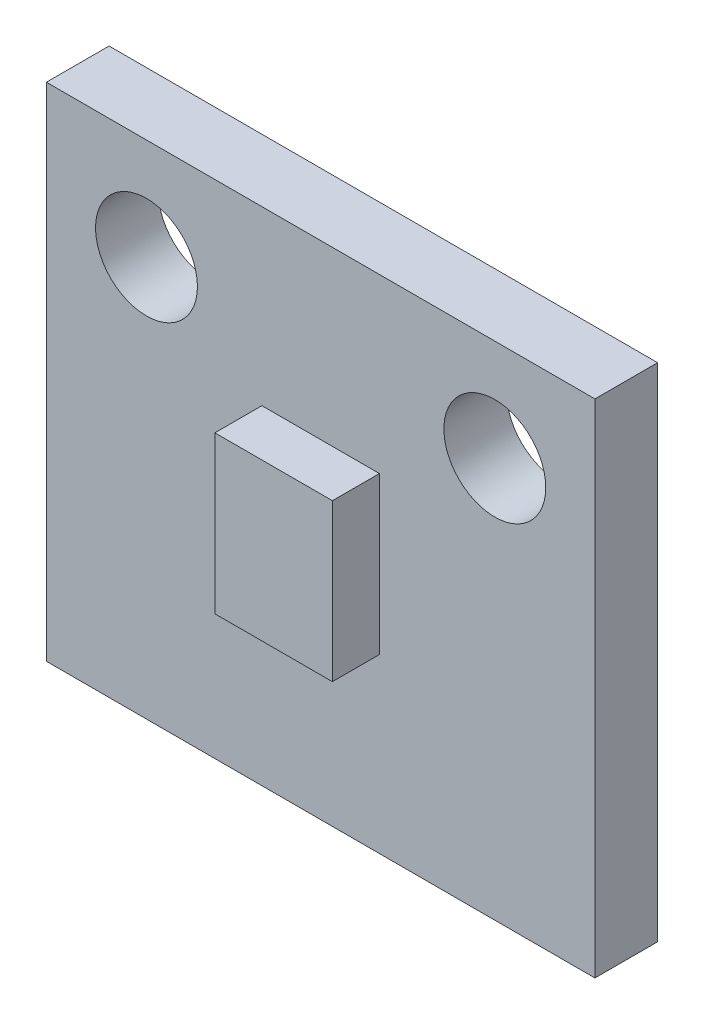
ISO-10303-21;
HEADER;
FILE_DESCRIPTION(('STEP AP214'),'2;1');
FILE_NAME('part.step','',(''),(''),'','','');
FILE_SCHEMA(('AUTOMOTIVE_DESIGN { 1 0 10303 214 1 1 1 1 }'));
ENDSEC;
DATA;
#1=APPLICATION_CONTEXT('core data for automotive mechanical design processes');
#2=APPLICATION_PROTOCOL_DEFINITION('international standard','automotive_design',2000,#1);
#3=PRODUCT_CONTEXT('',#1,'mechanical');
#4=PRODUCT('Part','Part','',(#3));
#5=PRODUCT_RELATED_PRODUCT_CATEGORY('part','',(#4));
#6=PRODUCT_DEFINITION_FORMATION('','',#4);
#7=PRODUCT_DEFINITION_CONTEXT('part definition',#1,'design');
#8=PRODUCT_DEFINITION('design','',#6,#7);
#9=PRODUCT_DEFINITION_SHAPE('','',#8);
#10=(LENGTH_UNIT() NAMED_UNIT(*) SI_UNIT(.MILLI.,.METRE.));
#11=(NAMED_UNIT(*) PLANE_ANGLE_UNIT() SI_UNIT($,.RADIAN.));
#12=(NAMED_UNIT(*) SI_UNIT($,.STERADIAN.) SOLID_ANGLE_UNIT());
#13=UNCERTAINTY_MEASURE_WITH_UNIT(LENGTH_MEASURE(1.E-05),#10,'distance_accuracy_value','');
#14=(GEOMETRIC_REPRESENTATION_CONTEXT(3) GLOBAL_UNCERTAINTY_ASSIGNED_CONTEXT((#13)) GLOBAL_UNIT_ASSIGNED_CONTEXT((#10,
#11,#12)) REPRESENTATION_CONTEXT('',''));
#15=CARTESIAN_POINT('',(0.,0.,0.));
#16=DIRECTION('',(0.,0.,1.));
#17=DIRECTION('',(1.,0.,0.));
#18=AXIS2_PLACEMENT_3D('',#15,#16,#17);
#19=CARTESIAN_POINT('',(0.,0.,-7.4));
#20=DIRECTION('',(0.,0.,-1.));
#21=DIRECTION('',(-1.,0.,0.));
#22=AXIS2_PLACEMENT_3D('',#19,#20,#21);
#23=PLANE('',#22);
#24=CARTESIAN_POINT('',(60.555,36.81,-7.4));
#25=DIRECTION('',(0.,0.,1.));
#26=DIRECTION('',(1.,0.,0.));
#27=AXIS2_PLACEMENT_3D('',#24,#25,#26);
#28=CIRCLE('',#27,1.3);
#29=CARTESIAN_POINT('',(61.855,36.81,-7.4));
#30=VERTEX_POINT('',#29);
#31=EDGE_CURVE('E266',#30,#30,#28,.T.);
#32=ORIENTED_EDGE('',*,*,#31,.F.);
#33=EDGE_LOOP('',(#32));
#34=FACE_BOUND('',#33,.T.);
#35=CARTESIAN_POINT('',(69.445,36.81,-7.4));
#36=DIRECTION('',(0.,0.,1.));
#37=DIRECTION('',(1.,0.,0.));
#38=AXIS2_PLACEMENT_3D('',#35,#36,#37);
#39=CIRCLE('',#38,1.3);
#40=CARTESIAN_POINT('',(70.745,36.81,-7.4));
#41=VERTEX_POINT('',#40);
#42=EDGE_CURVE('E270',#41,#41,#39,.T.);
#43=ORIENTED_EDGE('',*,*,#42,.F.);
#44=EDGE_LOOP('',(#43));
#45=FACE_BOUND('',#44,.T.);
#46=DIRECTION('',(0.,-1.,0.));
#47=VECTOR('',#46,1.);
#48=CARTESIAN_POINT('',(58.,26.6,-7.4));
#49=LINE('',#48,#47);
#50=CARTESIAN_POINT('',(58.,39.4,-7.4));
#51=VERTEX_POINT('',#50);
#52=CARTESIAN_POINT('',(58.,26.6,-7.4));
#53=VERTEX_POINT('',#52);
#54=EDGE_CURVE('E131',#51,#53,#49,.T.);
#55=ORIENTED_EDGE('',*,*,#54,.T.);
#56=DIRECTION('',(1.,0.,0.));
#57=VECTOR('',#56,1.);
#58=CARTESIAN_POINT('',(58.,26.6,-7.4));
#59=LINE('',#58,#57);
#60=CARTESIAN_POINT('',(72.,26.6,-7.4));
#61=VERTEX_POINT('',#60);
#62=EDGE_CURVE('E140',#53,#61,#59,.T.);
#63=ORIENTED_EDGE('',*,*,#62,.T.);
#64=DIRECTION('',(0.,1.,0.));
#65=VECTOR('',#64,1.);
#66=CARTESIAN_POINT('',(72.,26.6,-7.4));
#67=LINE('',#66,#65);
#68=CARTESIAN_POINT('',(72.,39.4,-7.4));
#69=VERTEX_POINT('',#68);
#70=EDGE_CURVE('E142',#61,#69,#67,.T.);
#71=ORIENTED_EDGE('',*,*,#70,.T.);
#72=DIRECTION('',(-1.,0.,0.));
#73=VECTOR('',#72,1.);
#74=CARTESIAN_POINT('',(58.,39.4,-7.4));
#75=LINE('',#74,#73);
#76=EDGE_CURVE('E141',#69,#51,#75,.T.);
#77=ORIENTED_EDGE('',*,*,#76,.T.);
#78=EDGE_LOOP('',(#55,#63,#71,#77));
#79=FACE_BOUND('',#78,.T.);
#80=DIRECTION('',(0.,-1.,0.));
#81=VECTOR('',#80,1.);
#82=CARTESIAN_POINT('',(63.5,31.,-7.4));
#83=LINE('',#82,#81);
#84=CARTESIAN_POINT('',(63.5,35.,-7.4));
#85=VERTEX_POINT('',#84);
#86=CARTESIAN_POINT('',(63.5,31.,-7.4));
#87=VERTEX_POINT('',#86);
#88=EDGE_CURVE('E57',#85,#87,#83,.T.);
#89=ORIENTED_EDGE('',*,*,#88,.F.);
#90=DIRECTION('',(-1.,0.,0.));
#91=VECTOR('',#90,1.);
#92=CARTESIAN_POINT('',(63.5,35.,-7.4));
#93=LINE('',#92,#91);
#94=CARTESIAN_POINT('',(66.5,35.,-7.4));
#95=VERTEX_POINT('',#94);
#96=EDGE_CURVE('E58',#95,#85,#93,.T.);
#97=ORIENTED_EDGE('',*,*,#96,.F.);
#98=DIRECTION('',(0.,1.,0.));
#99=VECTOR('',#98,1.);
#100=CARTESIAN_POINT('',(66.5,31.,-7.4));
#101=LINE('',#100,#99);
#102=CARTESIAN_POINT('',(66.5,31.,-7.4));
#103=VERTEX_POINT('',#102);
#104=EDGE_CURVE('E282',#103,#95,#101,.T.);
#105=ORIENTED_EDGE('',*,*,#104,.F.);
#106=DIRECTION('',(1.,0.,0.));
#107=VECTOR('',#106,1.);
#108=CARTESIAN_POINT('',(63.5,31.,-7.4));
#109=LINE('',#108,#107);
#110=EDGE_CURVE('E283',#87,#103,#109,.T.);
#111=ORIENTED_EDGE('',*,*,#110,.F.);
#112=EDGE_LOOP('',(#89,#97,#105,#111));
#113=FACE_BOUND('',#112,.T.);
#114=ADVANCED_FACE('F41',(#34,#45,#79,#113),#23,.F.);
#115=CARTESIAN_POINT('',(58.,26.6,-7.4));
#116=DIRECTION('',(1.,0.,0.));
#117=DIRECTION('',(0.,0.,-1.));
#118=AXIS2_PLACEMENT_3D('',#115,#116,#117);
#119=PLANE('',#118);
#120=DIRECTION('',(0.,-1.,0.));
#121=VECTOR('',#120,1.);
#122=CARTESIAN_POINT('',(58.,26.6,-9.));
#123=LINE('',#122,#121);
#124=CARTESIAN_POINT('',(58.,39.4,-9.));
#125=VERTEX_POINT('',#124);
#126=CARTESIAN_POINT('',(58.,26.6,-9.));
#127=VERTEX_POINT('',#126);
#128=EDGE_CURVE('E128',#125,#127,#123,.T.);
#129=ORIENTED_EDGE('',*,*,#128,.T.);
#130=DIRECTION('',(0.,0.,-1.));
#131=VECTOR('',#130,1.);
#132=CARTESIAN_POINT('',(58.,26.6,-7.4));
#133=LINE('',#132,#131);
#134=EDGE_CURVE('E11',#53,#127,#133,.T.);
#135=ORIENTED_EDGE('',*,*,#134,.F.);
#136=ORIENTED_EDGE('',*,*,#54,.F.);
#137=DIRECTION('',(0.,0.,-1.));
#138=VECTOR('',#137,1.);
#139=CARTESIAN_POINT('',(58.,39.4,-7.4));
#140=LINE('',#139,#138);
#141=EDGE_CURVE('E144',#51,#125,#140,.T.);
#142=ORIENTED_EDGE('',*,*,#141,.T.);
#143=EDGE_LOOP('',(#129,#135,#136,#142));
#144=FACE_BOUND('',#143,.T.);
#145=ADVANCED_FACE('F43',(#144),#119,.F.);
#146=CARTESIAN_POINT('',(58.,26.6,-7.4));
#147=DIRECTION('',(0.,1.,0.));
#148=DIRECTION('',(0.,0.,1.));
#149=AXIS2_PLACEMENT_3D('',#146,#147,#148);
#150=PLANE('',#149);
#151=DIRECTION('',(1.,0.,0.));
#152=VECTOR('',#151,1.);
#153=CARTESIAN_POINT('',(58.,26.6,-9.));
#154=LINE('',#153,#152);
#155=CARTESIAN_POINT('',(72.,26.6,-9.));
#156=VERTEX_POINT('',#155);
#157=EDGE_CURVE('E129',#127,#156,#154,.T.);
#158=ORIENTED_EDGE('',*,*,#157,.T.);
#159=DIRECTION('',(0.,0.,-1.));
#160=VECTOR('',#159,1.);
#161=CARTESIAN_POINT('',(72.,26.6,-7.4));
#162=LINE('',#161,#160);
#163=EDGE_CURVE('E47',#61,#156,#162,.T.);
#164=ORIENTED_EDGE('',*,*,#163,.F.);
#165=ORIENTED_EDGE('',*,*,#62,.F.);
#166=ORIENTED_EDGE('',*,*,#134,.T.);
#167=EDGE_LOOP('',(#158,#164,#165,#166));
#168=FACE_BOUND('',#167,.T.);
#169=ADVANCED_FACE('F172',(#168),#150,.F.);
#170=CARTESIAN_POINT('',(72.,26.6,-7.4));
#171=DIRECTION('',(-1.,0.,0.));
#172=DIRECTION('',(0.,0.,1.));
#173=AXIS2_PLACEMENT_3D('',#170,#171,#172);
#174=PLANE('',#173);
#175=DIRECTION('',(0.,1.,0.));
#176=VECTOR('',#175,1.);
#177=CARTESIAN_POINT('',(72.,26.6,-9.));
#178=LINE('',#177,#176);
#179=CARTESIAN_POINT('',(72.,39.4,-9.));
#180=VERTEX_POINT('',#179);
#181=EDGE_CURVE('E150',#156,#180,#178,.T.);
#182=ORIENTED_EDGE('',*,*,#181,.T.);
#183=DIRECTION('',(0.,0.,-1.));
#184=VECTOR('',#183,1.);
#185=CARTESIAN_POINT('',(72.,39.4,-7.4));
#186=LINE('',#185,#184);
#187=EDGE_CURVE('E154',#69,#180,#186,.T.);
#188=ORIENTED_EDGE('',*,*,#187,.F.);
#189=ORIENTED_EDGE('',*,*,#70,.F.);
#190=ORIENTED_EDGE('',*,*,#163,.T.);
#191=EDGE_LOOP('',(#182,#188,#189,#190));
#192=FACE_BOUND('',#191,.T.);
#193=ADVANCED_FACE('F158',(#192),#174,.F.);
#194=CARTESIAN_POINT('',(58.,39.4,-7.4));
#195=DIRECTION('',(0.,-1.,0.));
#196=DIRECTION('',(0.,0.,-1.));
#197=AXIS2_PLACEMENT_3D('',#194,#195,#196);
#198=PLANE('',#197);
#199=DIRECTION('',(-1.,0.,0.));
#200=VECTOR('',#199,1.);
#201=CARTESIAN_POINT('',(58.,39.4,-9.));
#202=LINE('',#201,#200);
#203=EDGE_CURVE('E138',#180,#125,#202,.T.);
#204=ORIENTED_EDGE('',*,*,#203,.T.);
#205=ORIENTED_EDGE('',*,*,#141,.F.);
#206=ORIENTED_EDGE('',*,*,#76,.F.);
#207=ORIENTED_EDGE('',*,*,#187,.T.);
#208=EDGE_LOOP('',(#204,#205,#206,#207));
#209=FACE_BOUND('',#208,.T.);
#210=ADVANCED_FACE('F166',(#209),#198,.F.);
#211=CARTESIAN_POINT('',(0.,0.,-9.));
#212=DIRECTION('',(0.,0.,-1.));
#213=DIRECTION('',(-1.,0.,0.));
#214=AXIS2_PLACEMENT_3D('',#211,#212,#213);
#215=PLANE('',#214);
#216=CARTESIAN_POINT('',(60.555,36.81,-9.));
#217=DIRECTION('',(0.,0.,1.));
#218=DIRECTION('',(1.,0.,0.));
#219=AXIS2_PLACEMENT_3D('',#216,#217,#218);
#220=CIRCLE('',#219,1.3);
#221=CARTESIAN_POINT('',(61.855,36.81,-9.));
#222=VERTEX_POINT('',#221);
#223=EDGE_CURVE('E261',#222,#222,#220,.T.);
#224=ORIENTED_EDGE('',*,*,#223,.T.);
#225=EDGE_LOOP('',(#224));
#226=FACE_BOUND('',#225,.T.);
#227=CARTESIAN_POINT('',(69.445,36.81,-9.));
#228=DIRECTION('',(0.,0.,1.));
#229=DIRECTION('',(1.,0.,0.));
#230=AXIS2_PLACEMENT_3D('',#227,#228,#229);
#231=CIRCLE('',#230,1.3);
#232=CARTESIAN_POINT('',(70.745,36.81,-9.));
#233=VERTEX_POINT('',#232);
#234=EDGE_CURVE('E275',#233,#233,#231,.T.);
#235=ORIENTED_EDGE('',*,*,#234,.T.);
#236=EDGE_LOOP('',(#235));
#237=FACE_BOUND('',#236,.T.);
#238=ORIENTED_EDGE('',*,*,#128,.F.);
#239=ORIENTED_EDGE('',*,*,#203,.F.);
#240=ORIENTED_EDGE('',*,*,#181,.F.);
#241=ORIENTED_EDGE('',*,*,#157,.F.);
#242=EDGE_LOOP('',(#238,#239,#240,#241));
#243=FACE_BOUND('',#242,.T.);
#244=ADVANCED_FACE('F164',(#226,#237,#243),#215,.T.);
#245=CARTESIAN_POINT('',(63.5,31.,-6.2));
#246=DIRECTION('',(1.,0.,0.));
#247=DIRECTION('',(0.,0.,-1.));
#248=AXIS2_PLACEMENT_3D('',#245,#246,#247);
#249=PLANE('',#248);
#250=ORIENTED_EDGE('',*,*,#88,.T.);
#251=DIRECTION('',(0.,0.,-1.));
#252=VECTOR('',#251,1.);
#253=CARTESIAN_POINT('',(63.5,31.,-6.2));
#254=LINE('',#253,#252);
#255=CARTESIAN_POINT('',(63.5,31.,-6.2));
#256=VERTEX_POINT('',#255);
#257=EDGE_CURVE('E107',#256,#87,#254,.T.);
#258=ORIENTED_EDGE('',*,*,#257,.F.);
#259=DIRECTION('',(0.,-1.,0.));
#260=VECTOR('',#259,1.);
#261=CARTESIAN_POINT('',(63.5,31.,-6.2));
#262=LINE('',#261,#260);
#263=CARTESIAN_POINT('',(63.5,35.,-6.2));
#264=VERTEX_POINT('',#263);
#265=EDGE_CURVE('E114',#264,#256,#262,.T.);
#266=ORIENTED_EDGE('',*,*,#265,.F.);
#267=DIRECTION('',(0.,0.,-1.));
#268=VECTOR('',#267,1.);
#269=CARTESIAN_POINT('',(63.5,35.,-6.2));
#270=LINE('',#269,#268);
#271=EDGE_CURVE('E279',#264,#85,#270,.T.);
#272=ORIENTED_EDGE('',*,*,#271,.T.);
#273=EDGE_LOOP('',(#250,#258,#266,#272));
#274=FACE_BOUND('',#273,.T.);
#275=ADVANCED_FACE('F123',(#274),#249,.F.);
#276=CARTESIAN_POINT('',(63.5,31.,-6.2));
#277=DIRECTION('',(0.,1.,0.));
#278=DIRECTION('',(0.,0.,1.));
#279=AXIS2_PLACEMENT_3D('',#276,#277,#278);
#280=PLANE('',#279);
#281=ORIENTED_EDGE('',*,*,#110,.T.);
#282=DIRECTION('',(0.,0.,-1.));
#283=VECTOR('',#282,1.);
#284=CARTESIAN_POINT('',(66.5,31.,-6.2));
#285=LINE('',#284,#283);
#286=CARTESIAN_POINT('',(66.5,31.,-6.2));
#287=VERTEX_POINT('',#286);
#288=EDGE_CURVE('E111',#287,#103,#285,.T.);
#289=ORIENTED_EDGE('',*,*,#288,.F.);
#290=DIRECTION('',(1.,0.,0.));
#291=VECTOR('',#290,1.);
#292=CARTESIAN_POINT('',(63.5,31.,-6.2));
#293=LINE('',#292,#291);
#294=EDGE_CURVE('E104',#256,#287,#293,.T.);
#295=ORIENTED_EDGE('',*,*,#294,.F.);
#296=ORIENTED_EDGE('',*,*,#257,.T.);
#297=EDGE_LOOP('',(#281,#289,#295,#296));
#298=FACE_BOUND('',#297,.T.);
#299=ADVANCED_FACE('F110',(#298),#280,.F.);
#300=CARTESIAN_POINT('',(66.5,31.,-6.2));
#301=DIRECTION('',(-1.,0.,0.));
#302=DIRECTION('',(0.,0.,1.));
#303=AXIS2_PLACEMENT_3D('',#300,#301,#302);
#304=PLANE('',#303);
#305=ORIENTED_EDGE('',*,*,#104,.T.);
#306=DIRECTION('',(0.,0.,-1.));
#307=VECTOR('',#306,1.);
#308=CARTESIAN_POINT('',(66.5,35.,-6.2));
#309=LINE('',#308,#307);
#310=CARTESIAN_POINT('',(66.5,35.,-6.2));
#311=VERTEX_POINT('',#310);
#312=EDGE_CURVE('E133',#311,#95,#309,.T.);
#313=ORIENTED_EDGE('',*,*,#312,.F.);
#314=DIRECTION('',(0.,1.,0.));
#315=VECTOR('',#314,1.);
#316=CARTESIAN_POINT('',(66.5,31.,-6.2));
#317=LINE('',#316,#315);
#318=EDGE_CURVE('E112',#287,#311,#317,.T.);
#319=ORIENTED_EDGE('',*,*,#318,.F.);
#320=ORIENTED_EDGE('',*,*,#288,.T.);
#321=EDGE_LOOP('',(#305,#313,#319,#320));
#322=FACE_BOUND('',#321,.T.);
#323=ADVANCED_FACE('F212',(#322),#304,.F.);
#324=CARTESIAN_POINT('',(63.5,35.,-6.2));
#325=DIRECTION('',(0.,-1.,0.));
#326=DIRECTION('',(0.,0.,-1.));
#327=AXIS2_PLACEMENT_3D('',#324,#325,#326);
#328=PLANE('',#327);
#329=ORIENTED_EDGE('',*,*,#96,.T.);
#330=ORIENTED_EDGE('',*,*,#271,.F.);
#331=DIRECTION('',(-1.,0.,0.));
#332=VECTOR('',#331,1.);
#333=CARTESIAN_POINT('',(63.5,35.,-6.2));
#334=LINE('',#333,#332);
#335=EDGE_CURVE('E119',#311,#264,#334,.T.);
#336=ORIENTED_EDGE('',*,*,#335,.F.);
#337=ORIENTED_EDGE('',*,*,#312,.T.);
#338=EDGE_LOOP('',(#329,#330,#336,#337));
#339=FACE_BOUND('',#338,.T.);
#340=ADVANCED_FACE('F221',(#339),#328,.F.);
#341=CARTESIAN_POINT('',(0.,0.,-6.2));
#342=DIRECTION('',(0.,0.,-1.));
#343=DIRECTION('',(-1.,0.,0.));
#344=AXIS2_PLACEMENT_3D('',#341,#342,#343);
#345=PLANE('',#344);
#346=ORIENTED_EDGE('',*,*,#265,.T.);
#347=ORIENTED_EDGE('',*,*,#294,.T.);
#348=ORIENTED_EDGE('',*,*,#318,.T.);
#349=ORIENTED_EDGE('',*,*,#335,.T.);
#350=EDGE_LOOP('',(#346,#347,#348,#349));
#351=FACE_BOUND('',#350,.T.);
#352=ADVANCED_FACE('F117',(#351),#345,.F.);
#353=CARTESIAN_POINT('',(69.445,36.81,-9.));
#354=DIRECTION('',(0.,0.,1.));
#355=DIRECTION('',(1.,0.,0.));
#356=AXIS2_PLACEMENT_3D('',#353,#354,#355);
#357=CYLINDRICAL_SURFACE('',#356,1.3);
#358=ORIENTED_EDGE('',*,*,#234,.F.);
#359=EDGE_LOOP('',(#358));
#360=FACE_BOUND('',#359,.T.);
#361=ORIENTED_EDGE('',*,*,#42,.T.);
#362=EDGE_LOOP('',(#361));
#363=FACE_BOUND('',#362,.T.);
#364=ADVANCED_FACE('F240',(#360,#363),#357,.F.);
#365=CARTESIAN_POINT('',(60.555,36.81,-9.));
#366=DIRECTION('',(0.,0.,1.));
#367=DIRECTION('',(1.,0.,0.));
#368=AXIS2_PLACEMENT_3D('',#365,#366,#367);
#369=CYLINDRICAL_SURFACE('',#368,1.3);
#370=ORIENTED_EDGE('',*,*,#223,.F.);
#371=EDGE_LOOP('',(#370));
#372=FACE_BOUND('',#371,.T.);
#373=ORIENTED_EDGE('',*,*,#31,.T.);
#374=EDGE_LOOP('',(#373));
#375=FACE_BOUND('',#374,.T.);
#376=ADVANCED_FACE('F248',(#372,#375),#369,.F.);
#377=CLOSED_SHELL('',(#114,#145,#169,#193,#210,#244,#275,#299,#323,#340,#352,#364,#376));
#378=MANIFOLD_SOLID_BREP('B2',#377);
#379=ADVANCED_BREP_SHAPE_REPRESENTATION('',(#18,#378),#14);
#380=SHAPE_DEFINITION_REPRESENTATION(#9,#379);
ENDSEC;
END-ISO-10303-21;
